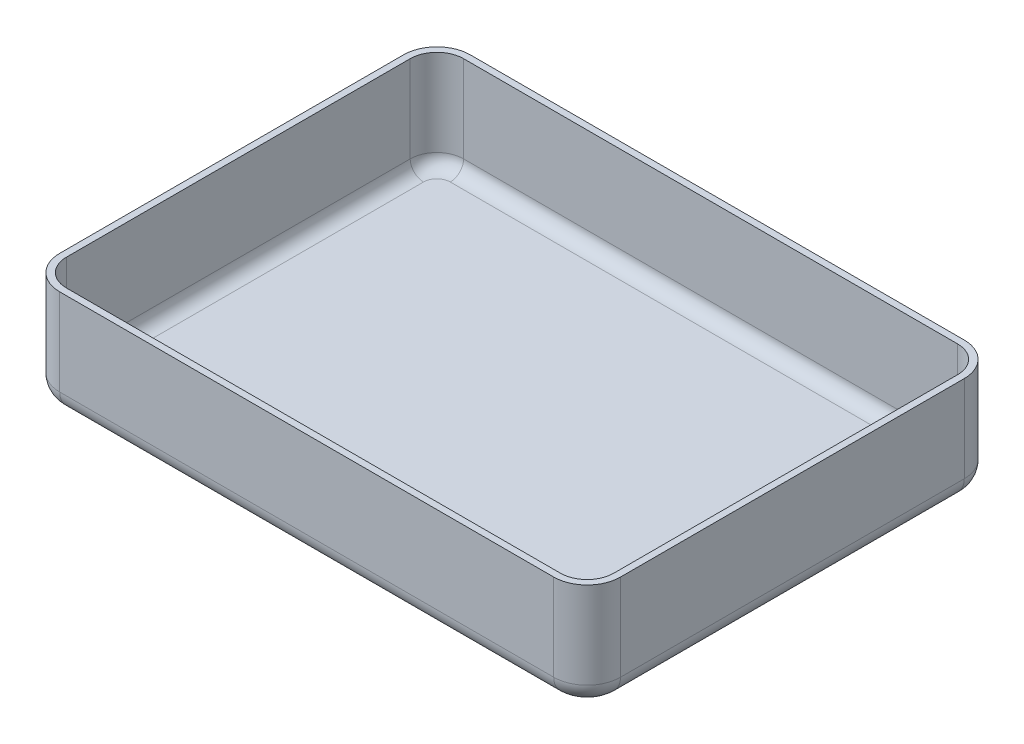
ISO-10303-21;
HEADER;
FILE_DESCRIPTION(('STEP AP214'),'2;1');
FILE_NAME('part.step','',(''),(''),'','','');
FILE_SCHEMA(('AUTOMOTIVE_DESIGN { 1 0 10303 214 1 1 1 1 }'));
ENDSEC;
DATA;
#1=APPLICATION_CONTEXT('core data for automotive mechanical design processes');
#2=APPLICATION_PROTOCOL_DEFINITION('international standard','automotive_design',2000,#1);
#3=PRODUCT_CONTEXT('',#1,'mechanical');
#4=PRODUCT('Part','Part','',(#3));
#5=PRODUCT_RELATED_PRODUCT_CATEGORY('part','',(#4));
#6=PRODUCT_DEFINITION_FORMATION('','',#4);
#7=PRODUCT_DEFINITION_CONTEXT('part definition',#1,'design');
#8=PRODUCT_DEFINITION('design','',#6,#7);
#9=PRODUCT_DEFINITION_SHAPE('','',#8);
#10=(LENGTH_UNIT() NAMED_UNIT(*) SI_UNIT(.MILLI.,.METRE.));
#11=(NAMED_UNIT(*) PLANE_ANGLE_UNIT() SI_UNIT($,.RADIAN.));
#12=(NAMED_UNIT(*) SI_UNIT($,.STERADIAN.) SOLID_ANGLE_UNIT());
#13=UNCERTAINTY_MEASURE_WITH_UNIT(LENGTH_MEASURE(1.E-05),#10,'distance_accuracy_value','');
#14=(GEOMETRIC_REPRESENTATION_CONTEXT(3) GLOBAL_UNCERTAINTY_ASSIGNED_CONTEXT((#13)) GLOBAL_UNIT_ASSIGNED_CONTEXT((#10,
#11,#12)) REPRESENTATION_CONTEXT('',''));
#15=CARTESIAN_POINT('',(0.,0.,0.));
#16=DIRECTION('',(0.,0.,1.));
#17=DIRECTION('',(1.,0.,0.));
#18=AXIS2_PLACEMENT_3D('',#15,#16,#17);
#19=CARTESIAN_POINT('',(74.,15.,-51.5));
#20=DIRECTION('',(0.,-1.,0.));
#21=DIRECTION('',(0.,0.,-1.));
#22=AXIS2_PLACEMENT_3D('',#19,#20,#21);
#23=PLANE('',#22);
#24=CARTESIAN_POINT('',(74.,15.,-51.5));
#25=DIRECTION('',(0.,-1.,0.));
#26=DIRECTION('',(0.,0.,-1.));
#27=AXIS2_PLACEMENT_3D('',#24,#25,#26);
#28=CIRCLE('',#27,10.);
#29=CARTESIAN_POINT('',(84.,15.,-51.5));
#30=VERTEX_POINT('',#29);
#31=CARTESIAN_POINT('',(74.,15.,-61.5));
#32=VERTEX_POINT('',#31);
#33=EDGE_CURVE('E194',#30,#32,#28,.F.);
#34=ORIENTED_EDGE('',*,*,#33,.T.);
#35=DIRECTION('',(-1.,0.,0.));
#36=VECTOR('',#35,1.);
#37=CARTESIAN_POINT('',(-74.,15.,-61.5));
#38=LINE('',#37,#36);
#39=CARTESIAN_POINT('',(-74.,15.,-61.5));
#40=VERTEX_POINT('',#39);
#41=EDGE_CURVE('E146',#32,#40,#38,.T.);
#42=ORIENTED_EDGE('',*,*,#41,.T.);
#43=CARTESIAN_POINT('',(-74.,15.,-51.5));
#44=DIRECTION('',(0.,-1.,0.));
#45=DIRECTION('',(0.,0.,-1.));
#46=AXIS2_PLACEMENT_3D('',#43,#44,#45);
#47=CIRCLE('',#46,10.);
#48=CARTESIAN_POINT('',(-84.,15.,-51.5));
#49=VERTEX_POINT('',#48);
#50=EDGE_CURVE('E205',#40,#49,#47,.F.);
#51=ORIENTED_EDGE('',*,*,#50,.T.);
#52=DIRECTION('',(0.,0.,1.));
#53=VECTOR('',#52,1.);
#54=CARTESIAN_POINT('',(-84.,15.,-51.5));
#55=LINE('',#54,#53);
#56=CARTESIAN_POINT('',(-84.,15.,51.5));
#57=VERTEX_POINT('',#56);
#58=EDGE_CURVE('E208',#49,#57,#55,.T.);
#59=ORIENTED_EDGE('',*,*,#58,.T.);
#60=CARTESIAN_POINT('',(-74.,15.,51.5));
#61=DIRECTION('',(0.,-1.,0.));
#62=DIRECTION('',(0.,0.,-1.));
#63=AXIS2_PLACEMENT_3D('',#60,#61,#62);
#64=CIRCLE('',#63,10.);
#65=CARTESIAN_POINT('',(-74.,15.,61.5));
#66=VERTEX_POINT('',#65);
#67=EDGE_CURVE('E211',#57,#66,#64,.F.);
#68=ORIENTED_EDGE('',*,*,#67,.T.);
#69=DIRECTION('',(1.,0.,0.));
#70=VECTOR('',#69,1.);
#71=CARTESIAN_POINT('',(-74.,15.,61.5));
#72=LINE('',#71,#70);
#73=CARTESIAN_POINT('',(74.,15.,61.5));
#74=VERTEX_POINT('',#73);
#75=EDGE_CURVE('E214',#66,#74,#72,.T.);
#76=ORIENTED_EDGE('',*,*,#75,.T.);
#77=CARTESIAN_POINT('',(74.,15.,51.5));
#78=DIRECTION('',(0.,-1.,0.));
#79=DIRECTION('',(0.,0.,-1.));
#80=AXIS2_PLACEMENT_3D('',#77,#78,#79);
#81=CIRCLE('',#80,10.);
#82=CARTESIAN_POINT('',(84.,15.,51.5));
#83=VERTEX_POINT('',#82);
#84=EDGE_CURVE('E216',#74,#83,#81,.F.);
#85=ORIENTED_EDGE('',*,*,#84,.T.);
#86=DIRECTION('',(0.,0.,-1.));
#87=VECTOR('',#86,1.);
#88=CARTESIAN_POINT('',(84.,15.,-51.5));
#89=LINE('',#88,#87);
#90=EDGE_CURVE('E36',#83,#30,#89,.T.);
#91=ORIENTED_EDGE('',*,*,#90,.T.);
#92=EDGE_LOOP('',(#34,#42,#51,#59,#68,#76,#85,#91));
#93=FACE_BOUND('',#92,.T.);
#94=CARTESIAN_POINT('',(74.,15.,-51.5));
#95=DIRECTION('',(0.,1.,0.));
#96=DIRECTION('',(0.,0.,-1.));
#97=AXIS2_PLACEMENT_3D('',#94,#95,#96);
#98=CIRCLE('',#97,8.);
#99=CARTESIAN_POINT('',(82.,15.,-51.5));
#100=VERTEX_POINT('',#99);
#101=CARTESIAN_POINT('',(74.,15.,-59.5));
#102=VERTEX_POINT('',#101);
#103=EDGE_CURVE('E420',#100,#102,#98,.T.);
#104=ORIENTED_EDGE('',*,*,#103,.F.);
#105=DIRECTION('',(0.,0.,-1.));
#106=VECTOR('',#105,1.);
#107=CARTESIAN_POINT('',(82.,15.,-51.5));
#108=LINE('',#107,#106);
#109=CARTESIAN_POINT('',(82.,15.,51.5));
#110=VERTEX_POINT('',#109);
#111=EDGE_CURVE('E448',#110,#100,#108,.T.);
#112=ORIENTED_EDGE('',*,*,#111,.F.);
#113=CARTESIAN_POINT('',(74.,15.,51.5));
#114=DIRECTION('',(0.,1.,0.));
#115=DIRECTION('',(0.,0.,-1.));
#116=AXIS2_PLACEMENT_3D('',#113,#114,#115);
#117=CIRCLE('',#116,8.);
#118=CARTESIAN_POINT('',(74.,15.,59.5));
#119=VERTEX_POINT('',#118);
#120=EDGE_CURVE('E49',#119,#110,#117,.T.);
#121=ORIENTED_EDGE('',*,*,#120,.F.);
#122=DIRECTION('',(1.,0.,0.));
#123=VECTOR('',#122,1.);
#124=CARTESIAN_POINT('',(-74.,15.,59.5));
#125=LINE('',#124,#123);
#126=CARTESIAN_POINT('',(-74.,15.,59.5));
#127=VERTEX_POINT('',#126);
#128=EDGE_CURVE('E444',#127,#119,#125,.T.);
#129=ORIENTED_EDGE('',*,*,#128,.F.);
#130=CARTESIAN_POINT('',(-74.,15.,51.5));
#131=DIRECTION('',(0.,1.,0.));
#132=DIRECTION('',(0.,0.,-1.));
#133=AXIS2_PLACEMENT_3D('',#130,#131,#132);
#134=CIRCLE('',#133,8.);
#135=CARTESIAN_POINT('',(-82.,15.,51.5));
#136=VERTEX_POINT('',#135);
#137=EDGE_CURVE('E441',#136,#127,#134,.T.);
#138=ORIENTED_EDGE('',*,*,#137,.F.);
#139=DIRECTION('',(0.,0.,1.));
#140=VECTOR('',#139,1.);
#141=CARTESIAN_POINT('',(-82.,15.,-51.5));
#142=LINE('',#141,#140);
#143=CARTESIAN_POINT('',(-82.,15.,-51.5));
#144=VERTEX_POINT('',#143);
#145=EDGE_CURVE('E438',#144,#136,#142,.T.);
#146=ORIENTED_EDGE('',*,*,#145,.F.);
#147=CARTESIAN_POINT('',(-74.,15.,-51.5));
#148=DIRECTION('',(0.,1.,0.));
#149=DIRECTION('',(0.,0.,-1.));
#150=AXIS2_PLACEMENT_3D('',#147,#148,#149);
#151=CIRCLE('',#150,8.);
#152=CARTESIAN_POINT('',(-74.,15.,-59.5));
#153=VERTEX_POINT('',#152);
#154=EDGE_CURVE('E433',#153,#144,#151,.T.);
#155=ORIENTED_EDGE('',*,*,#154,.F.);
#156=DIRECTION('',(-1.,0.,0.));
#157=VECTOR('',#156,1.);
#158=CARTESIAN_POINT('',(-74.,15.,-59.5));
#159=LINE('',#158,#157);
#160=EDGE_CURVE('E425',#102,#153,#159,.T.);
#161=ORIENTED_EDGE('',*,*,#160,.F.);
#162=EDGE_LOOP('',(#104,#112,#121,#129,#138,#146,#155,#161));
#163=FACE_BOUND('',#162,.T.);
#164=ADVANCED_FACE('F32',(#93,#163),#23,.F.);
#165=CARTESIAN_POINT('',(74.,-15.,-51.5));
#166=DIRECTION('',(0.,1.,0.));
#167=DIRECTION('',(0.,0.,1.));
#168=AXIS2_PLACEMENT_3D('',#165,#166,#167);
#169=CYLINDRICAL_SURFACE('',#168,10.);
#170=DIRECTION('',(0.,1.,0.));
#171=VECTOR('',#170,1.);
#172=CARTESIAN_POINT('',(84.,-15.,-51.5));
#173=LINE('',#172,#171);
#174=CARTESIAN_POINT('',(84.,-11.,-51.5));
#175=VERTEX_POINT('',#174);
#176=EDGE_CURVE('E127',#175,#30,#173,.T.);
#177=ORIENTED_EDGE('',*,*,#176,.F.);
#178=CARTESIAN_POINT('',(74.,-11.,-51.5));
#179=DIRECTION('',(0.,1.,0.));
#180=DIRECTION('',(0.,0.,1.));
#181=AXIS2_PLACEMENT_3D('',#178,#179,#180);
#182=CIRCLE('',#181,10.);
#183=CARTESIAN_POINT('',(74.,-11.,-61.5));
#184=VERTEX_POINT('',#183);
#185=EDGE_CURVE('E11',#175,#184,#182,.T.);
#186=ORIENTED_EDGE('',*,*,#185,.T.);
#187=DIRECTION('',(0.,1.,0.));
#188=VECTOR('',#187,1.);
#189=CARTESIAN_POINT('',(74.,-15.,-61.5));
#190=LINE('',#189,#188);
#191=EDGE_CURVE('E133',#184,#32,#190,.T.);
#192=ORIENTED_EDGE('',*,*,#191,.T.);
#193=ORIENTED_EDGE('',*,*,#33,.F.);
#194=EDGE_LOOP('',(#177,#186,#192,#193));
#195=FACE_BOUND('',#194,.T.);
#196=ADVANCED_FACE('F132',(#195),#169,.T.);
#197=CARTESIAN_POINT('',(84.,-15.,-51.5));
#198=DIRECTION('',(1.,0.,0.));
#199=DIRECTION('',(0.,0.,-1.));
#200=AXIS2_PLACEMENT_3D('',#197,#198,#199);
#201=PLANE('',#200);
#202=DIRECTION('',(0.,1.,0.));
#203=VECTOR('',#202,1.);
#204=CARTESIAN_POINT('',(84.,-15.,51.5));
#205=LINE('',#204,#203);
#206=CARTESIAN_POINT('',(84.,-11.,51.5));
#207=VERTEX_POINT('',#206);
#208=EDGE_CURVE('E165',#207,#83,#205,.T.);
#209=ORIENTED_EDGE('',*,*,#208,.F.);
#210=DIRECTION('',(0.,0.,-1.));
#211=VECTOR('',#210,1.);
#212=CARTESIAN_POINT('',(84.,-11.,-51.5));
#213=LINE('',#212,#211);
#214=EDGE_CURVE('E41',#207,#175,#213,.T.);
#215=ORIENTED_EDGE('',*,*,#214,.T.);
#216=ORIENTED_EDGE('',*,*,#176,.T.);
#217=ORIENTED_EDGE('',*,*,#90,.F.);
#218=EDGE_LOOP('',(#209,#215,#216,#217));
#219=FACE_BOUND('',#218,.T.);
#220=ADVANCED_FACE('F222',(#219),#201,.T.);
#221=CARTESIAN_POINT('',(74.,-15.,51.5));
#222=DIRECTION('',(0.,1.,0.));
#223=DIRECTION('',(0.,0.,1.));
#224=AXIS2_PLACEMENT_3D('',#221,#222,#223);
#225=CYLINDRICAL_SURFACE('',#224,10.);
#226=DIRECTION('',(0.,1.,0.));
#227=VECTOR('',#226,1.);
#228=CARTESIAN_POINT('',(74.,-15.,61.5));
#229=LINE('',#228,#227);
#230=CARTESIAN_POINT('',(74.,-11.,61.5));
#231=VERTEX_POINT('',#230);
#232=EDGE_CURVE('E225',#231,#74,#229,.T.);
#233=ORIENTED_EDGE('',*,*,#232,.F.);
#234=CARTESIAN_POINT('',(74.,-11.,51.5));
#235=DIRECTION('',(0.,1.,0.));
#236=DIRECTION('',(0.,0.,1.));
#237=AXIS2_PLACEMENT_3D('',#234,#235,#236);
#238=CIRCLE('',#237,10.);
#239=EDGE_CURVE('E231',#231,#207,#238,.T.);
#240=ORIENTED_EDGE('',*,*,#239,.T.);
#241=ORIENTED_EDGE('',*,*,#208,.T.);
#242=ORIENTED_EDGE('',*,*,#84,.F.);
#243=EDGE_LOOP('',(#233,#240,#241,#242));
#244=FACE_BOUND('',#243,.T.);
#245=ADVANCED_FACE('F270',(#244),#225,.T.);
#246=CARTESIAN_POINT('',(-74.,-15.,61.5));
#247=DIRECTION('',(0.,0.,1.));
#248=DIRECTION('',(1.,0.,0.));
#249=AXIS2_PLACEMENT_3D('',#246,#247,#248);
#250=PLANE('',#249);
#251=DIRECTION('',(0.,1.,0.));
#252=VECTOR('',#251,1.);
#253=CARTESIAN_POINT('',(-74.,-15.,61.5));
#254=LINE('',#253,#252);
#255=CARTESIAN_POINT('',(-74.,-11.,61.5));
#256=VERTEX_POINT('',#255);
#257=EDGE_CURVE('E239',#256,#66,#254,.T.);
#258=ORIENTED_EDGE('',*,*,#257,.F.);
#259=DIRECTION('',(1.,0.,0.));
#260=VECTOR('',#259,1.);
#261=CARTESIAN_POINT('',(-74.,-11.,61.5));
#262=LINE('',#261,#260);
#263=EDGE_CURVE('E236',#256,#231,#262,.T.);
#264=ORIENTED_EDGE('',*,*,#263,.T.);
#265=ORIENTED_EDGE('',*,*,#232,.T.);
#266=ORIENTED_EDGE('',*,*,#75,.F.);
#267=EDGE_LOOP('',(#258,#264,#265,#266));
#268=FACE_BOUND('',#267,.T.);
#269=ADVANCED_FACE('F267',(#268),#250,.T.);
#270=CARTESIAN_POINT('',(-74.,-15.,51.5));
#271=DIRECTION('',(0.,1.,0.));
#272=DIRECTION('',(0.,0.,1.));
#273=AXIS2_PLACEMENT_3D('',#270,#271,#272);
#274=CYLINDRICAL_SURFACE('',#273,10.);
#275=DIRECTION('',(0.,1.,0.));
#276=VECTOR('',#275,1.);
#277=CARTESIAN_POINT('',(-84.,-15.,51.5));
#278=LINE('',#277,#276);
#279=CARTESIAN_POINT('',(-84.,-11.,51.5));
#280=VERTEX_POINT('',#279);
#281=EDGE_CURVE('E242',#280,#57,#278,.T.);
#282=ORIENTED_EDGE('',*,*,#281,.F.);
#283=CARTESIAN_POINT('',(-74.,-11.,51.5));
#284=DIRECTION('',(0.,1.,0.));
#285=DIRECTION('',(0.,0.,1.));
#286=AXIS2_PLACEMENT_3D('',#283,#284,#285);
#287=CIRCLE('',#286,10.);
#288=EDGE_CURVE('E244',#280,#256,#287,.T.);
#289=ORIENTED_EDGE('',*,*,#288,.T.);
#290=ORIENTED_EDGE('',*,*,#257,.T.);
#291=ORIENTED_EDGE('',*,*,#67,.F.);
#292=EDGE_LOOP('',(#282,#289,#290,#291));
#293=FACE_BOUND('',#292,.T.);
#294=ADVANCED_FACE('F262',(#293),#274,.T.);
#295=CARTESIAN_POINT('',(-84.,-15.,-51.5));
#296=DIRECTION('',(-1.,0.,0.));
#297=DIRECTION('',(0.,0.,1.));
#298=AXIS2_PLACEMENT_3D('',#295,#296,#297);
#299=PLANE('',#298);
#300=DIRECTION('',(0.,1.,0.));
#301=VECTOR('',#300,1.);
#302=CARTESIAN_POINT('',(-84.,-15.,-51.5));
#303=LINE('',#302,#301);
#304=CARTESIAN_POINT('',(-84.,-11.,-51.5));
#305=VERTEX_POINT('',#304);
#306=EDGE_CURVE('E246',#305,#49,#303,.T.);
#307=ORIENTED_EDGE('',*,*,#306,.F.);
#308=DIRECTION('',(0.,0.,1.));
#309=VECTOR('',#308,1.);
#310=CARTESIAN_POINT('',(-84.,-11.,-51.5));
#311=LINE('',#310,#309);
#312=EDGE_CURVE('E248',#305,#280,#311,.T.);
#313=ORIENTED_EDGE('',*,*,#312,.T.);
#314=ORIENTED_EDGE('',*,*,#281,.T.);
#315=ORIENTED_EDGE('',*,*,#58,.F.);
#316=EDGE_LOOP('',(#307,#313,#314,#315));
#317=FACE_BOUND('',#316,.T.);
#318=ADVANCED_FACE('F257',(#317),#299,.T.);
#319=CARTESIAN_POINT('',(-74.,-15.,-51.5));
#320=DIRECTION('',(0.,1.,0.));
#321=DIRECTION('',(0.,0.,1.));
#322=AXIS2_PLACEMENT_3D('',#319,#320,#321);
#323=CYLINDRICAL_SURFACE('',#322,10.);
#324=DIRECTION('',(0.,1.,0.));
#325=VECTOR('',#324,1.);
#326=CARTESIAN_POINT('',(-74.,-15.,-61.5));
#327=LINE('',#326,#325);
#328=CARTESIAN_POINT('',(-74.,-11.,-61.5));
#329=VERTEX_POINT('',#328);
#330=EDGE_CURVE('E148',#329,#40,#327,.T.);
#331=ORIENTED_EDGE('',*,*,#330,.F.);
#332=CARTESIAN_POINT('',(-74.,-11.,-51.5));
#333=DIRECTION('',(0.,1.,0.));
#334=DIRECTION('',(0.,0.,1.));
#335=AXIS2_PLACEMENT_3D('',#332,#333,#334);
#336=CIRCLE('',#335,10.);
#337=EDGE_CURVE('E169',#329,#305,#336,.T.);
#338=ORIENTED_EDGE('',*,*,#337,.T.);
#339=ORIENTED_EDGE('',*,*,#306,.T.);
#340=ORIENTED_EDGE('',*,*,#50,.F.);
#341=EDGE_LOOP('',(#331,#338,#339,#340));
#342=FACE_BOUND('',#341,.T.);
#343=ADVANCED_FACE('F252',(#342),#323,.T.);
#344=CARTESIAN_POINT('',(-74.,-15.,-61.5));
#345=DIRECTION('',(0.,0.,-1.));
#346=DIRECTION('',(-1.,0.,0.));
#347=AXIS2_PLACEMENT_3D('',#344,#345,#346);
#348=PLANE('',#347);
#349=ORIENTED_EDGE('',*,*,#191,.F.);
#350=DIRECTION('',(-1.,0.,0.));
#351=VECTOR('',#350,1.);
#352=CARTESIAN_POINT('',(-74.,-11.,-61.5));
#353=LINE('',#352,#351);
#354=EDGE_CURVE('E143',#184,#329,#353,.T.);
#355=ORIENTED_EDGE('',*,*,#354,.T.);
#356=ORIENTED_EDGE('',*,*,#330,.T.);
#357=ORIENTED_EDGE('',*,*,#41,.F.);
#358=EDGE_LOOP('',(#349,#355,#356,#357));
#359=FACE_BOUND('',#358,.T.);
#360=ADVANCED_FACE('F141',(#359),#348,.T.);
#361=CARTESIAN_POINT('',(74.,-17.,-51.5));
#362=DIRECTION('',(0.,-1.,0.));
#363=DIRECTION('',(0.,0.,-1.));
#364=AXIS2_PLACEMENT_3D('',#361,#362,#363);
#365=PLANE('',#364);
#366=CARTESIAN_POINT('',(-74.,-17.,-51.5));
#367=DIRECTION('',(0.,-1.,0.));
#368=DIRECTION('',(0.,0.,-1.));
#369=AXIS2_PLACEMENT_3D('',#366,#367,#368);
#370=CIRCLE('',#369,4.);
#371=CARTESIAN_POINT('',(-78.,-17.,-51.5));
#372=VERTEX_POINT('',#371);
#373=CARTESIAN_POINT('',(-74.,-17.,-55.5));
#374=VERTEX_POINT('',#373);
#375=EDGE_CURVE('E174',#372,#374,#370,.T.);
#376=ORIENTED_EDGE('',*,*,#375,.T.);
#377=DIRECTION('',(1.,0.,0.));
#378=VECTOR('',#377,1.);
#379=CARTESIAN_POINT('',(74.,-17.,-55.5));
#380=LINE('',#379,#378);
#381=CARTESIAN_POINT('',(74.,-17.,-55.5));
#382=VERTEX_POINT('',#381);
#383=EDGE_CURVE('E176',#374,#382,#380,.T.);
#384=ORIENTED_EDGE('',*,*,#383,.T.);
#385=CARTESIAN_POINT('',(74.,-17.,-51.5));
#386=DIRECTION('',(0.,-1.,0.));
#387=DIRECTION('',(0.,0.,-1.));
#388=AXIS2_PLACEMENT_3D('',#385,#386,#387);
#389=CIRCLE('',#388,4.);
#390=CARTESIAN_POINT('',(78.,-17.,-51.5));
#391=VERTEX_POINT('',#390);
#392=EDGE_CURVE('E153',#382,#391,#389,.T.);
#393=ORIENTED_EDGE('',*,*,#392,.T.);
#394=DIRECTION('',(0.,0.,-1.));
#395=VECTOR('',#394,1.);
#396=CARTESIAN_POINT('',(78.,-17.,-51.5));
#397=LINE('',#396,#395);
#398=CARTESIAN_POINT('',(78.,-17.,51.5));
#399=VERTEX_POINT('',#398);
#400=EDGE_CURVE('E163',#391,#399,#397,.F.);
#401=ORIENTED_EDGE('',*,*,#400,.T.);
#402=CARTESIAN_POINT('',(74.,-17.,51.5));
#403=DIRECTION('',(0.,-1.,0.));
#404=DIRECTION('',(0.,0.,-1.));
#405=AXIS2_PLACEMENT_3D('',#402,#403,#404);
#406=CIRCLE('',#405,4.);
#407=CARTESIAN_POINT('',(74.,-17.,55.5));
#408=VERTEX_POINT('',#407);
#409=EDGE_CURVE('E180',#399,#408,#406,.T.);
#410=ORIENTED_EDGE('',*,*,#409,.T.);
#411=DIRECTION('',(1.,0.,0.));
#412=VECTOR('',#411,1.);
#413=CARTESIAN_POINT('',(74.,-17.,55.5));
#414=LINE('',#413,#412);
#415=CARTESIAN_POINT('',(-74.,-17.,55.5));
#416=VERTEX_POINT('',#415);
#417=EDGE_CURVE('E182',#408,#416,#414,.F.);
#418=ORIENTED_EDGE('',*,*,#417,.T.);
#419=CARTESIAN_POINT('',(-74.,-17.,51.5));
#420=DIRECTION('',(0.,-1.,0.));
#421=DIRECTION('',(0.,0.,-1.));
#422=AXIS2_PLACEMENT_3D('',#419,#420,#421);
#423=CIRCLE('',#422,4.);
#424=CARTESIAN_POINT('',(-78.,-17.,51.5));
#425=VERTEX_POINT('',#424);
#426=EDGE_CURVE('E184',#416,#425,#423,.T.);
#427=ORIENTED_EDGE('',*,*,#426,.T.);
#428=DIRECTION('',(0.,0.,-1.));
#429=VECTOR('',#428,1.);
#430=CARTESIAN_POINT('',(-78.,-17.,-51.5));
#431=LINE('',#430,#429);
#432=EDGE_CURVE('E177',#425,#372,#431,.T.);
#433=ORIENTED_EDGE('',*,*,#432,.T.);
#434=EDGE_LOOP('',(#376,#384,#393,#401,#410,#418,#427,#433));
#435=FACE_BOUND('',#434,.T.);
#436=ADVANCED_FACE('F637',(#435),#365,.T.);
#437=CARTESIAN_POINT('',(-74.,-11.,55.5));
#438=DIRECTION('',(1.,0.,0.));
#439=DIRECTION('',(0.,0.,-1.));
#440=AXIS2_PLACEMENT_3D('',#437,#438,#439);
#441=CYLINDRICAL_SURFACE('',#440,6.);
#442=CARTESIAN_POINT('',(-74.,-11.,55.5));
#443=DIRECTION('',(1.,0.,0.));
#444=DIRECTION('',(0.,0.,-1.));
#445=AXIS2_PLACEMENT_3D('',#442,#443,#444);
#446=CIRCLE('',#445,6.);
#447=EDGE_CURVE('E187',#416,#256,#446,.F.);
#448=ORIENTED_EDGE('',*,*,#447,.F.);
#449=ORIENTED_EDGE('',*,*,#417,.F.);
#450=CARTESIAN_POINT('',(74.,-11.,55.5));
#451=DIRECTION('',(1.,0.,0.));
#452=DIRECTION('',(0.,0.,-1.));
#453=AXIS2_PLACEMENT_3D('',#450,#451,#452);
#454=CIRCLE('',#453,6.);
#455=EDGE_CURVE('E190',#231,#408,#454,.T.);
#456=ORIENTED_EDGE('',*,*,#455,.F.);
#457=ORIENTED_EDGE('',*,*,#263,.F.);
#458=EDGE_LOOP('',(#448,#449,#456,#457));
#459=FACE_BOUND('',#458,.T.);
#460=ADVANCED_FACE('F645',(#459),#441,.T.);
#461=CARTESIAN_POINT('',(74.,-11.,51.5));
#462=DIRECTION('',(0.,-1.,0.));
#463=DIRECTION('',(0.,0.,-1.));
#464=AXIS2_PLACEMENT_3D('',#461,#462,#463);
#465=DEGENERATE_TOROIDAL_SURFACE('',#464,4.,6.,.T.);
#466=ORIENTED_EDGE('',*,*,#455,.T.);
#467=ORIENTED_EDGE('',*,*,#409,.F.);
#468=CARTESIAN_POINT('',(78.,-11.,51.5));
#469=DIRECTION('',(0.,0.,-1.));
#470=DIRECTION('',(-1.,0.,0.));
#471=AXIS2_PLACEMENT_3D('',#468,#469,#470);
#472=CIRCLE('',#471,6.);
#473=EDGE_CURVE('E191',#207,#399,#472,.T.);
#474=ORIENTED_EDGE('',*,*,#473,.F.);
#475=ORIENTED_EDGE('',*,*,#239,.F.);
#476=EDGE_LOOP('',(#466,#467,#474,#475));
#477=FACE_BOUND('',#476,.T.);
#478=ADVANCED_FACE('F230',(#477),#465,.T.);
#479=CARTESIAN_POINT('',(-74.,-11.,51.5));
#480=DIRECTION('',(0.,-1.,0.));
#481=DIRECTION('',(0.,0.,-1.));
#482=AXIS2_PLACEMENT_3D('',#479,#480,#481);
#483=DEGENERATE_TOROIDAL_SURFACE('',#482,4.,6.,.T.);
#484=ORIENTED_EDGE('',*,*,#447,.T.);
#485=ORIENTED_EDGE('',*,*,#288,.F.);
#486=CARTESIAN_POINT('',(-78.,-11.,51.5));
#487=DIRECTION('',(0.,0.,1.));
#488=DIRECTION('',(1.,0.,0.));
#489=AXIS2_PLACEMENT_3D('',#486,#487,#488);
#490=CIRCLE('',#489,6.);
#491=EDGE_CURVE('E172',#425,#280,#490,.F.);
#492=ORIENTED_EDGE('',*,*,#491,.F.);
#493=ORIENTED_EDGE('',*,*,#426,.F.);
#494=EDGE_LOOP('',(#484,#485,#492,#493));
#495=FACE_BOUND('',#494,.T.);
#496=ADVANCED_FACE('F662',(#495),#483,.T.);
#497=CARTESIAN_POINT('',(78.,-11.,-51.5));
#498=DIRECTION('',(0.,0.,-1.));
#499=DIRECTION('',(-1.,0.,0.));
#500=AXIS2_PLACEMENT_3D('',#497,#498,#499);
#501=CYLINDRICAL_SURFACE('',#500,6.);
#502=ORIENTED_EDGE('',*,*,#473,.T.);
#503=ORIENTED_EDGE('',*,*,#400,.F.);
#504=CARTESIAN_POINT('',(78.,-11.,-51.5));
#505=DIRECTION('',(0.,0.,-1.));
#506=DIRECTION('',(-1.,0.,0.));
#507=AXIS2_PLACEMENT_3D('',#504,#505,#506);
#508=CIRCLE('',#507,6.);
#509=EDGE_CURVE('E171',#175,#391,#508,.T.);
#510=ORIENTED_EDGE('',*,*,#509,.F.);
#511=ORIENTED_EDGE('',*,*,#214,.F.);
#512=EDGE_LOOP('',(#502,#503,#510,#511));
#513=FACE_BOUND('',#512,.T.);
#514=ADVANCED_FACE('F234',(#513),#501,.T.);
#515=CARTESIAN_POINT('',(-78.,-11.,-51.5));
#516=DIRECTION('',(0.,0.,1.));
#517=DIRECTION('',(1.,0.,0.));
#518=AXIS2_PLACEMENT_3D('',#515,#516,#517);
#519=CYLINDRICAL_SURFACE('',#518,6.);
#520=ORIENTED_EDGE('',*,*,#491,.T.);
#521=ORIENTED_EDGE('',*,*,#312,.F.);
#522=CARTESIAN_POINT('',(-78.,-11.,-51.5));
#523=DIRECTION('',(0.,0.,1.));
#524=DIRECTION('',(1.,0.,0.));
#525=AXIS2_PLACEMENT_3D('',#522,#523,#524);
#526=CIRCLE('',#525,6.);
#527=EDGE_CURVE('E157',#372,#305,#526,.F.);
#528=ORIENTED_EDGE('',*,*,#527,.F.);
#529=ORIENTED_EDGE('',*,*,#432,.F.);
#530=EDGE_LOOP('',(#520,#521,#528,#529));
#531=FACE_BOUND('',#530,.T.);
#532=ADVANCED_FACE('F678',(#531),#519,.T.);
#533=CARTESIAN_POINT('',(74.,-11.,-51.5));
#534=DIRECTION('',(0.,-1.,0.));
#535=DIRECTION('',(0.,0.,-1.));
#536=AXIS2_PLACEMENT_3D('',#533,#534,#535);
#537=DEGENERATE_TOROIDAL_SURFACE('',#536,4.,6.,.T.);
#538=ORIENTED_EDGE('',*,*,#509,.T.);
#539=ORIENTED_EDGE('',*,*,#392,.F.);
#540=CARTESIAN_POINT('',(74.,-11.,-55.5));
#541=DIRECTION('',(-1.,0.,0.));
#542=DIRECTION('',(0.,0.,1.));
#543=AXIS2_PLACEMENT_3D('',#540,#541,#542);
#544=CIRCLE('',#543,6.);
#545=EDGE_CURVE('E151',#184,#382,#544,.T.);
#546=ORIENTED_EDGE('',*,*,#545,.F.);
#547=ORIENTED_EDGE('',*,*,#185,.F.);
#548=EDGE_LOOP('',(#538,#539,#546,#547));
#549=FACE_BOUND('',#548,.T.);
#550=ADVANCED_FACE('F152',(#549),#537,.T.);
#551=CARTESIAN_POINT('',(-74.,-11.,-51.5));
#552=DIRECTION('',(0.,-1.,0.));
#553=DIRECTION('',(0.,0.,-1.));
#554=AXIS2_PLACEMENT_3D('',#551,#552,#553);
#555=DEGENERATE_TOROIDAL_SURFACE('',#554,4.,6.,.T.);
#556=ORIENTED_EDGE('',*,*,#527,.T.);
#557=ORIENTED_EDGE('',*,*,#337,.F.);
#558=CARTESIAN_POINT('',(-74.,-11.,-55.5));
#559=DIRECTION('',(-1.,0.,0.));
#560=DIRECTION('',(0.,0.,1.));
#561=AXIS2_PLACEMENT_3D('',#558,#559,#560);
#562=CIRCLE('',#561,6.);
#563=EDGE_CURVE('E158',#374,#329,#562,.F.);
#564=ORIENTED_EDGE('',*,*,#563,.F.);
#565=ORIENTED_EDGE('',*,*,#375,.F.);
#566=EDGE_LOOP('',(#556,#557,#564,#565));
#567=FACE_BOUND('',#566,.T.);
#568=ADVANCED_FACE('F694',(#567),#555,.T.);
#569=CARTESIAN_POINT('',(-74.,-11.,-55.5));
#570=DIRECTION('',(-1.,0.,0.));
#571=DIRECTION('',(0.,0.,1.));
#572=AXIS2_PLACEMENT_3D('',#569,#570,#571);
#573=CYLINDRICAL_SURFACE('',#572,6.);
#574=ORIENTED_EDGE('',*,*,#545,.T.);
#575=ORIENTED_EDGE('',*,*,#383,.F.);
#576=ORIENTED_EDGE('',*,*,#563,.T.);
#577=ORIENTED_EDGE('',*,*,#354,.F.);
#578=EDGE_LOOP('',(#574,#575,#576,#577));
#579=FACE_BOUND('',#578,.T.);
#580=ADVANCED_FACE('F34',(#579),#573,.T.);
#581=CARTESIAN_POINT('',(74.,-15.,-51.5));
#582=DIRECTION('',(0.,1.,0.));
#583=DIRECTION('',(0.,0.,1.));
#584=AXIS2_PLACEMENT_3D('',#581,#582,#583);
#585=CYLINDRICAL_SURFACE('',#584,8.);
#586=DIRECTION('',(0.,1.,0.));
#587=VECTOR('',#586,1.);
#588=CARTESIAN_POINT('',(82.,-15.,-51.5));
#589=LINE('',#588,#587);
#590=CARTESIAN_POINT('',(82.,-11.,-51.5));
#591=VERTEX_POINT('',#590);
#592=EDGE_CURVE('E452',#591,#100,#589,.T.);
#593=ORIENTED_EDGE('',*,*,#592,.T.);
#594=ORIENTED_EDGE('',*,*,#103,.T.);
#595=DIRECTION('',(0.,1.,0.));
#596=VECTOR('',#595,1.);
#597=CARTESIAN_POINT('',(74.,-15.,-59.5));
#598=LINE('',#597,#596);
#599=CARTESIAN_POINT('',(74.,-11.,-59.5));
#600=VERTEX_POINT('',#599);
#601=EDGE_CURVE('E451',#600,#102,#598,.T.);
#602=ORIENTED_EDGE('',*,*,#601,.F.);
#603=CARTESIAN_POINT('',(74.,-11.,-51.5));
#604=DIRECTION('',(0.,-1.,0.));
#605=DIRECTION('',(0.,0.,-1.));
#606=AXIS2_PLACEMENT_3D('',#603,#604,#605);
#607=CIRCLE('',#606,8.);
#608=EDGE_CURVE('E202',#591,#600,#607,.F.);
#609=ORIENTED_EDGE('',*,*,#608,.F.);
#610=EDGE_LOOP('',(#593,#594,#602,#609));
#611=FACE_BOUND('',#610,.T.);
#612=ADVANCED_FACE('F319',(#611),#585,.F.);
#613=CARTESIAN_POINT('',(82.,-15.,-51.5));
#614=DIRECTION('',(1.,0.,0.));
#615=DIRECTION('',(0.,0.,-1.));
#616=AXIS2_PLACEMENT_3D('',#613,#614,#615);
#617=PLANE('',#616);
#618=DIRECTION('',(0.,1.,0.));
#619=VECTOR('',#618,1.);
#620=CARTESIAN_POINT('',(82.,-15.,51.5));
#621=LINE('',#620,#619);
#622=CARTESIAN_POINT('',(82.,-11.,51.5));
#623=VERTEX_POINT('',#622);
#624=EDGE_CURVE('E455',#623,#110,#621,.T.);
#625=ORIENTED_EDGE('',*,*,#624,.T.);
#626=ORIENTED_EDGE('',*,*,#111,.T.);
#627=ORIENTED_EDGE('',*,*,#592,.F.);
#628=DIRECTION('',(0.,0.,-1.));
#629=VECTOR('',#628,1.);
#630=CARTESIAN_POINT('',(82.,-11.,-51.5));
#631=LINE('',#630,#629);
#632=EDGE_CURVE('E393',#623,#591,#631,.T.);
#633=ORIENTED_EDGE('',*,*,#632,.F.);
#634=EDGE_LOOP('',(#625,#626,#627,#633));
#635=FACE_BOUND('',#634,.T.);
#636=ADVANCED_FACE('F322',(#635),#617,.F.);
#637=CARTESIAN_POINT('',(74.,-15.,51.5));
#638=DIRECTION('',(0.,1.,0.));
#639=DIRECTION('',(0.,0.,1.));
#640=AXIS2_PLACEMENT_3D('',#637,#638,#639);
#641=CYLINDRICAL_SURFACE('',#640,8.);
#642=DIRECTION('',(0.,1.,0.));
#643=VECTOR('',#642,1.);
#644=CARTESIAN_POINT('',(74.,-15.,59.5));
#645=LINE('',#644,#643);
#646=CARTESIAN_POINT('',(74.,-11.,59.5));
#647=VERTEX_POINT('',#646);
#648=EDGE_CURVE('E457',#647,#119,#645,.T.);
#649=ORIENTED_EDGE('',*,*,#648,.T.);
#650=ORIENTED_EDGE('',*,*,#120,.T.);
#651=ORIENTED_EDGE('',*,*,#624,.F.);
#652=CARTESIAN_POINT('',(74.,-11.,51.5));
#653=DIRECTION('',(0.,-1.,0.));
#654=DIRECTION('',(0.,0.,-1.));
#655=AXIS2_PLACEMENT_3D('',#652,#653,#654);
#656=CIRCLE('',#655,8.);
#657=EDGE_CURVE('E390',#647,#623,#656,.F.);
#658=ORIENTED_EDGE('',*,*,#657,.F.);
#659=EDGE_LOOP('',(#649,#650,#651,#658));
#660=FACE_BOUND('',#659,.T.);
#661=ADVANCED_FACE('F343',(#660),#641,.F.);
#662=CARTESIAN_POINT('',(-74.,-15.,59.5));
#663=DIRECTION('',(0.,0.,1.));
#664=DIRECTION('',(1.,0.,0.));
#665=AXIS2_PLACEMENT_3D('',#662,#663,#664);
#666=PLANE('',#665);
#667=DIRECTION('',(0.,1.,0.));
#668=VECTOR('',#667,1.);
#669=CARTESIAN_POINT('',(-74.,-15.,59.5));
#670=LINE('',#669,#668);
#671=CARTESIAN_POINT('',(-74.,-11.,59.5));
#672=VERTEX_POINT('',#671);
#673=EDGE_CURVE('E459',#672,#127,#670,.T.);
#674=ORIENTED_EDGE('',*,*,#673,.T.);
#675=ORIENTED_EDGE('',*,*,#128,.T.);
#676=ORIENTED_EDGE('',*,*,#648,.F.);
#677=DIRECTION('',(1.,0.,0.));
#678=VECTOR('',#677,1.);
#679=CARTESIAN_POINT('',(-74.,-11.,59.5));
#680=LINE('',#679,#678);
#681=EDGE_CURVE('E387',#672,#647,#680,.T.);
#682=ORIENTED_EDGE('',*,*,#681,.F.);
#683=EDGE_LOOP('',(#674,#675,#676,#682));
#684=FACE_BOUND('',#683,.T.);
#685=ADVANCED_FACE('F339',(#684),#666,.F.);
#686=CARTESIAN_POINT('',(-74.,-15.,51.5));
#687=DIRECTION('',(0.,1.,0.));
#688=DIRECTION('',(0.,0.,1.));
#689=AXIS2_PLACEMENT_3D('',#686,#687,#688);
#690=CYLINDRICAL_SURFACE('',#689,8.);
#691=DIRECTION('',(0.,1.,0.));
#692=VECTOR('',#691,1.);
#693=CARTESIAN_POINT('',(-82.,-15.,51.5));
#694=LINE('',#693,#692);
#695=CARTESIAN_POINT('',(-82.,-11.,51.5));
#696=VERTEX_POINT('',#695);
#697=EDGE_CURVE('E462',#696,#136,#694,.T.);
#698=ORIENTED_EDGE('',*,*,#697,.T.);
#699=ORIENTED_EDGE('',*,*,#137,.T.);
#700=ORIENTED_EDGE('',*,*,#673,.F.);
#701=CARTESIAN_POINT('',(-74.,-11.,51.5));
#702=DIRECTION('',(0.,-1.,0.));
#703=DIRECTION('',(0.,0.,-1.));
#704=AXIS2_PLACEMENT_3D('',#701,#702,#703);
#705=CIRCLE('',#704,8.);
#706=EDGE_CURVE('E384',#696,#672,#705,.F.);
#707=ORIENTED_EDGE('',*,*,#706,.F.);
#708=EDGE_LOOP('',(#698,#699,#700,#707));
#709=FACE_BOUND('',#708,.T.);
#710=ADVANCED_FACE('F335',(#709),#690,.F.);
#711=CARTESIAN_POINT('',(-82.,-15.,-51.5));
#712=DIRECTION('',(-1.,0.,0.));
#713=DIRECTION('',(0.,0.,1.));
#714=AXIS2_PLACEMENT_3D('',#711,#712,#713);
#715=PLANE('',#714);
#716=DIRECTION('',(0.,1.,0.));
#717=VECTOR('',#716,1.);
#718=CARTESIAN_POINT('',(-82.,-15.,-51.5));
#719=LINE('',#718,#717);
#720=CARTESIAN_POINT('',(-82.,-11.,-51.5));
#721=VERTEX_POINT('',#720);
#722=EDGE_CURVE('E465',#721,#144,#719,.T.);
#723=ORIENTED_EDGE('',*,*,#722,.T.);
#724=ORIENTED_EDGE('',*,*,#145,.T.);
#725=ORIENTED_EDGE('',*,*,#697,.F.);
#726=DIRECTION('',(0.,0.,1.));
#727=VECTOR('',#726,1.);
#728=CARTESIAN_POINT('',(-82.,-11.,-51.5));
#729=LINE('',#728,#727);
#730=EDGE_CURVE('E381',#721,#696,#729,.T.);
#731=ORIENTED_EDGE('',*,*,#730,.F.);
#732=EDGE_LOOP('',(#723,#724,#725,#731));
#733=FACE_BOUND('',#732,.T.);
#734=ADVANCED_FACE('F331',(#733),#715,.F.);
#735=CARTESIAN_POINT('',(-74.,-15.,-51.5));
#736=DIRECTION('',(0.,1.,0.));
#737=DIRECTION('',(0.,0.,1.));
#738=AXIS2_PLACEMENT_3D('',#735,#736,#737);
#739=CYLINDRICAL_SURFACE('',#738,8.);
#740=DIRECTION('',(0.,1.,0.));
#741=VECTOR('',#740,1.);
#742=CARTESIAN_POINT('',(-74.,-15.,-59.5));
#743=LINE('',#742,#741);
#744=CARTESIAN_POINT('',(-74.,-11.,-59.5));
#745=VERTEX_POINT('',#744);
#746=EDGE_CURVE('E468',#745,#153,#743,.T.);
#747=ORIENTED_EDGE('',*,*,#746,.T.);
#748=ORIENTED_EDGE('',*,*,#154,.T.);
#749=ORIENTED_EDGE('',*,*,#722,.F.);
#750=CARTESIAN_POINT('',(-74.,-11.,-51.5));
#751=DIRECTION('',(0.,-1.,0.));
#752=DIRECTION('',(0.,0.,-1.));
#753=AXIS2_PLACEMENT_3D('',#750,#751,#752);
#754=CIRCLE('',#753,8.);
#755=EDGE_CURVE('E373',#745,#721,#754,.F.);
#756=ORIENTED_EDGE('',*,*,#755,.F.);
#757=EDGE_LOOP('',(#747,#748,#749,#756));
#758=FACE_BOUND('',#757,.T.);
#759=ADVANCED_FACE('F327',(#758),#739,.F.);
#760=CARTESIAN_POINT('',(-74.,-15.,-59.5));
#761=DIRECTION('',(0.,0.,-1.));
#762=DIRECTION('',(-1.,0.,0.));
#763=AXIS2_PLACEMENT_3D('',#760,#761,#762);
#764=PLANE('',#763);
#765=ORIENTED_EDGE('',*,*,#601,.T.);
#766=ORIENTED_EDGE('',*,*,#160,.T.);
#767=ORIENTED_EDGE('',*,*,#746,.F.);
#768=DIRECTION('',(-1.,0.,0.));
#769=VECTOR('',#768,1.);
#770=CARTESIAN_POINT('',(-74.,-11.,-59.5));
#771=LINE('',#770,#769);
#772=EDGE_CURVE('E454',#600,#745,#771,.T.);
#773=ORIENTED_EDGE('',*,*,#772,.F.);
#774=EDGE_LOOP('',(#765,#766,#767,#773));
#775=FACE_BOUND('',#774,.T.);
#776=ADVANCED_FACE('F324',(#775),#764,.F.);
#777=CARTESIAN_POINT('',(74.,-15.,-51.5));
#778=DIRECTION('',(0.,-1.,0.));
#779=DIRECTION('',(0.,0.,-1.));
#780=AXIS2_PLACEMENT_3D('',#777,#778,#779);
#781=PLANE('',#780);
#782=CARTESIAN_POINT('',(-74.,-15.,-51.5));
#783=DIRECTION('',(0.,-1.,0.));
#784=DIRECTION('',(0.,0.,-1.));
#785=AXIS2_PLACEMENT_3D('',#782,#783,#784);
#786=CIRCLE('',#785,4.);
#787=CARTESIAN_POINT('',(-78.,-15.,-51.5));
#788=VERTEX_POINT('',#787);
#789=CARTESIAN_POINT('',(-74.,-15.,-55.5));
#790=VERTEX_POINT('',#789);
#791=EDGE_CURVE('E359',#788,#790,#786,.T.);
#792=ORIENTED_EDGE('',*,*,#791,.F.);
#793=DIRECTION('',(0.,0.,1.));
#794=VECTOR('',#793,1.);
#795=CARTESIAN_POINT('',(-78.,-15.,-51.5));
#796=LINE('',#795,#794);
#797=CARTESIAN_POINT('',(-78.,-15.,51.5));
#798=VERTEX_POINT('',#797);
#799=EDGE_CURVE('E363',#798,#788,#796,.F.);
#800=ORIENTED_EDGE('',*,*,#799,.F.);
#801=CARTESIAN_POINT('',(-74.,-15.,51.5));
#802=DIRECTION('',(0.,-1.,0.));
#803=DIRECTION('',(0.,0.,-1.));
#804=AXIS2_PLACEMENT_3D('',#801,#802,#803);
#805=CIRCLE('',#804,4.);
#806=CARTESIAN_POINT('',(-74.,-15.,55.5));
#807=VERTEX_POINT('',#806);
#808=EDGE_CURVE('E375',#807,#798,#805,.T.);
#809=ORIENTED_EDGE('',*,*,#808,.F.);
#810=DIRECTION('',(1.,0.,0.));
#811=VECTOR('',#810,1.);
#812=CARTESIAN_POINT('',(74.,-15.,55.5));
#813=LINE('',#812,#811);
#814=CARTESIAN_POINT('',(74.,-15.,55.5));
#815=VERTEX_POINT('',#814);
#816=EDGE_CURVE('E484',#815,#807,#813,.F.);
#817=ORIENTED_EDGE('',*,*,#816,.F.);
#818=CARTESIAN_POINT('',(74.,-15.,51.5));
#819=DIRECTION('',(0.,-1.,0.));
#820=DIRECTION('',(0.,0.,-1.));
#821=AXIS2_PLACEMENT_3D('',#818,#819,#820);
#822=CIRCLE('',#821,4.);
#823=CARTESIAN_POINT('',(78.,-15.,51.5));
#824=VERTEX_POINT('',#823);
#825=EDGE_CURVE('E481',#824,#815,#822,.T.);
#826=ORIENTED_EDGE('',*,*,#825,.F.);
#827=DIRECTION('',(0.,0.,-1.));
#828=VECTOR('',#827,1.);
#829=CARTESIAN_POINT('',(78.,-15.,-51.5));
#830=LINE('',#829,#828);
#831=CARTESIAN_POINT('',(78.,-15.,-51.5));
#832=VERTEX_POINT('',#831);
#833=EDGE_CURVE('E478',#832,#824,#830,.F.);
#834=ORIENTED_EDGE('',*,*,#833,.F.);
#835=CARTESIAN_POINT('',(74.,-15.,-51.5));
#836=DIRECTION('',(0.,-1.,0.));
#837=DIRECTION('',(0.,0.,-1.));
#838=AXIS2_PLACEMENT_3D('',#835,#836,#837);
#839=CIRCLE('',#838,4.);
#840=CARTESIAN_POINT('',(74.,-15.,-55.5));
#841=VERTEX_POINT('',#840);
#842=EDGE_CURVE('E475',#841,#832,#839,.T.);
#843=ORIENTED_EDGE('',*,*,#842,.F.);
#844=DIRECTION('',(-1.,0.,0.));
#845=VECTOR('',#844,1.);
#846=CARTESIAN_POINT('',(74.,-15.,-55.5));
#847=LINE('',#846,#845);
#848=EDGE_CURVE('E367',#790,#841,#847,.F.);
#849=ORIENTED_EDGE('',*,*,#848,.F.);
#850=EDGE_LOOP('',(#792,#800,#809,#817,#826,#834,#843,#849));
#851=FACE_BOUND('',#850,.T.);
#852=ADVANCED_FACE('F290',(#851),#781,.F.);
#853=CARTESIAN_POINT('',(-74.,-11.,55.5));
#854=DIRECTION('',(1.,0.,0.));
#855=DIRECTION('',(0.,0.,-1.));
#856=AXIS2_PLACEMENT_3D('',#853,#854,#855);
#857=CYLINDRICAL_SURFACE('',#856,4.);
#858=CARTESIAN_POINT('',(-74.,-11.,55.5));
#859=DIRECTION('',(-1.,0.,0.));
#860=DIRECTION('',(0.,0.,1.));
#861=AXIS2_PLACEMENT_3D('',#858,#859,#860);
#862=CIRCLE('',#861,4.);
#863=EDGE_CURVE('E415',#807,#672,#862,.T.);
#864=ORIENTED_EDGE('',*,*,#863,.T.);
#865=ORIENTED_EDGE('',*,*,#681,.T.);
#866=CARTESIAN_POINT('',(74.,-11.,55.5));
#867=DIRECTION('',(1.,0.,0.));
#868=DIRECTION('',(0.,0.,-1.));
#869=AXIS2_PLACEMENT_3D('',#866,#867,#868);
#870=CIRCLE('',#869,4.);
#871=EDGE_CURVE('E418',#647,#815,#870,.T.);
#872=ORIENTED_EDGE('',*,*,#871,.T.);
#873=ORIENTED_EDGE('',*,*,#816,.T.);
#874=EDGE_LOOP('',(#864,#865,#872,#873));
#875=FACE_BOUND('',#874,.T.);
#876=ADVANCED_FACE('F286',(#875),#857,.F.);
#877=CARTESIAN_POINT('',(74.,-11.,51.5));
#878=DIRECTION('',(0.,-1.,0.));
#879=DIRECTION('',(0.,0.,-1.));
#880=AXIS2_PLACEMENT_3D('',#877,#878,#879);
#881=DEGENERATE_TOROIDAL_SURFACE('',#880,4.,4.,.T.);
#882=ORIENTED_EDGE('',*,*,#871,.F.);
#883=ORIENTED_EDGE('',*,*,#657,.T.);
#884=CARTESIAN_POINT('',(78.,-11.,51.5));
#885=DIRECTION('',(0.,0.,-1.));
#886=DIRECTION('',(-1.,0.,0.));
#887=AXIS2_PLACEMENT_3D('',#884,#885,#886);
#888=CIRCLE('',#887,4.);
#889=EDGE_CURVE('E412',#623,#824,#888,.T.);
#890=ORIENTED_EDGE('',*,*,#889,.T.);
#891=ORIENTED_EDGE('',*,*,#825,.T.);
#892=EDGE_LOOP('',(#882,#883,#890,#891));
#893=FACE_BOUND('',#892,.T.);
#894=ADVANCED_FACE('F289',(#893),#881,.F.);
#895=CARTESIAN_POINT('',(-74.,-11.,51.5));
#896=DIRECTION('',(0.,-1.,0.));
#897=DIRECTION('',(0.,0.,-1.));
#898=AXIS2_PLACEMENT_3D('',#895,#896,#897);
#899=DEGENERATE_TOROIDAL_SURFACE('',#898,4.,4.,.T.);
#900=ORIENTED_EDGE('',*,*,#863,.F.);
#901=ORIENTED_EDGE('',*,*,#808,.T.);
#902=CARTESIAN_POINT('',(-78.,-11.,51.5));
#903=DIRECTION('',(0.,0.,-1.));
#904=DIRECTION('',(-1.,0.,0.));
#905=AXIS2_PLACEMENT_3D('',#902,#903,#904);
#906=CIRCLE('',#905,4.);
#907=EDGE_CURVE('E409',#798,#696,#906,.T.);
#908=ORIENTED_EDGE('',*,*,#907,.T.);
#909=ORIENTED_EDGE('',*,*,#706,.T.);
#910=EDGE_LOOP('',(#900,#901,#908,#909));
#911=FACE_BOUND('',#910,.T.);
#912=ADVANCED_FACE('F294',(#911),#899,.F.);
#913=CARTESIAN_POINT('',(78.,-11.,-51.5));
#914=DIRECTION('',(0.,0.,-1.));
#915=DIRECTION('',(-1.,0.,0.));
#916=AXIS2_PLACEMENT_3D('',#913,#914,#915);
#917=CYLINDRICAL_SURFACE('',#916,4.);
#918=ORIENTED_EDGE('',*,*,#889,.F.);
#919=ORIENTED_EDGE('',*,*,#632,.T.);
#920=CARTESIAN_POINT('',(78.,-11.,-51.5));
#921=DIRECTION('',(0.,0.,-1.));
#922=DIRECTION('',(-1.,0.,0.));
#923=AXIS2_PLACEMENT_3D('',#920,#921,#922);
#924=CIRCLE('',#923,4.);
#925=EDGE_CURVE('E406',#591,#832,#924,.T.);
#926=ORIENTED_EDGE('',*,*,#925,.T.);
#927=ORIENTED_EDGE('',*,*,#833,.T.);
#928=EDGE_LOOP('',(#918,#919,#926,#927));
#929=FACE_BOUND('',#928,.T.);
#930=ADVANCED_FACE('F298',(#929),#917,.F.);
#931=CARTESIAN_POINT('',(-78.,-11.,-51.5));
#932=DIRECTION('',(0.,0.,1.));
#933=DIRECTION('',(1.,0.,0.));
#934=AXIS2_PLACEMENT_3D('',#931,#932,#933);
#935=CYLINDRICAL_SURFACE('',#934,4.);
#936=ORIENTED_EDGE('',*,*,#907,.F.);
#937=ORIENTED_EDGE('',*,*,#799,.T.);
#938=CARTESIAN_POINT('',(-78.,-11.,-51.5));
#939=DIRECTION('',(0.,0.,-1.));
#940=DIRECTION('',(-1.,0.,0.));
#941=AXIS2_PLACEMENT_3D('',#938,#939,#940);
#942=CIRCLE('',#941,4.);
#943=EDGE_CURVE('E403',#788,#721,#942,.T.);
#944=ORIENTED_EDGE('',*,*,#943,.T.);
#945=ORIENTED_EDGE('',*,*,#730,.T.);
#946=EDGE_LOOP('',(#936,#937,#944,#945));
#947=FACE_BOUND('',#946,.T.);
#948=ADVANCED_FACE('F302',(#947),#935,.F.);
#949=CARTESIAN_POINT('',(74.,-11.,-51.5));
#950=DIRECTION('',(0.,-1.,0.));
#951=DIRECTION('',(0.,0.,-1.));
#952=AXIS2_PLACEMENT_3D('',#949,#950,#951);
#953=DEGENERATE_TOROIDAL_SURFACE('',#952,4.,4.,.T.);
#954=ORIENTED_EDGE('',*,*,#925,.F.);
#955=ORIENTED_EDGE('',*,*,#608,.T.);
#956=CARTESIAN_POINT('',(74.,-11.,-55.5));
#957=DIRECTION('',(-1.,0.,0.));
#958=DIRECTION('',(0.,-1.,0.));
#959=AXIS2_PLACEMENT_3D('',#956,#957,#958);
#960=CIRCLE('',#959,4.);
#961=EDGE_CURVE('E400',#600,#841,#960,.T.);
#962=ORIENTED_EDGE('',*,*,#961,.T.);
#963=ORIENTED_EDGE('',*,*,#842,.T.);
#964=EDGE_LOOP('',(#954,#955,#962,#963));
#965=FACE_BOUND('',#964,.T.);
#966=ADVANCED_FACE('F306',(#965),#953,.F.);
#967=CARTESIAN_POINT('',(-74.,-11.,-51.5));
#968=DIRECTION('',(0.,-1.,0.));
#969=DIRECTION('',(0.,0.,-1.));
#970=AXIS2_PLACEMENT_3D('',#967,#968,#969);
#971=DEGENERATE_TOROIDAL_SURFACE('',#970,4.,4.,.T.);
#972=ORIENTED_EDGE('',*,*,#943,.F.);
#973=ORIENTED_EDGE('',*,*,#791,.T.);
#974=CARTESIAN_POINT('',(-74.,-11.,-55.5));
#975=DIRECTION('',(1.,0.,0.));
#976=DIRECTION('',(0.,0.,-1.));
#977=AXIS2_PLACEMENT_3D('',#974,#975,#976);
#978=CIRCLE('',#977,4.);
#979=EDGE_CURVE('E398',#790,#745,#978,.T.);
#980=ORIENTED_EDGE('',*,*,#979,.T.);
#981=ORIENTED_EDGE('',*,*,#755,.T.);
#982=EDGE_LOOP('',(#972,#973,#980,#981));
#983=FACE_BOUND('',#982,.T.);
#984=ADVANCED_FACE('F310',(#983),#971,.F.);
#985=CARTESIAN_POINT('',(-74.,-11.,-55.5));
#986=DIRECTION('',(-1.,0.,0.));
#987=DIRECTION('',(0.,0.,1.));
#988=AXIS2_PLACEMENT_3D('',#985,#986,#987);
#989=CYLINDRICAL_SURFACE('',#988,4.);
#990=ORIENTED_EDGE('',*,*,#961,.F.);
#991=ORIENTED_EDGE('',*,*,#772,.T.);
#992=ORIENTED_EDGE('',*,*,#979,.F.);
#993=ORIENTED_EDGE('',*,*,#848,.T.);
#994=EDGE_LOOP('',(#990,#991,#992,#993));
#995=FACE_BOUND('',#994,.T.);
#996=ADVANCED_FACE('F314',(#995),#989,.F.);
#997=CLOSED_SHELL('',(#164,#196,#220,#245,#269,#294,#318,#343,#360,#436,#460,#478,#496,#514,
#532,#550,#568,#580,#612,#636,#661,#685,#710,#734,#759,#776,#852,#876,#894,#912,#930,#948,#966,
#984,#996));
#998=MANIFOLD_SOLID_BREP('B2',#997);
#999=ADVANCED_BREP_SHAPE_REPRESENTATION('',(#18,#998),#14);
#1000=SHAPE_DEFINITION_REPRESENTATION(#9,#999);
ENDSEC;
END-ISO-10303-21;
